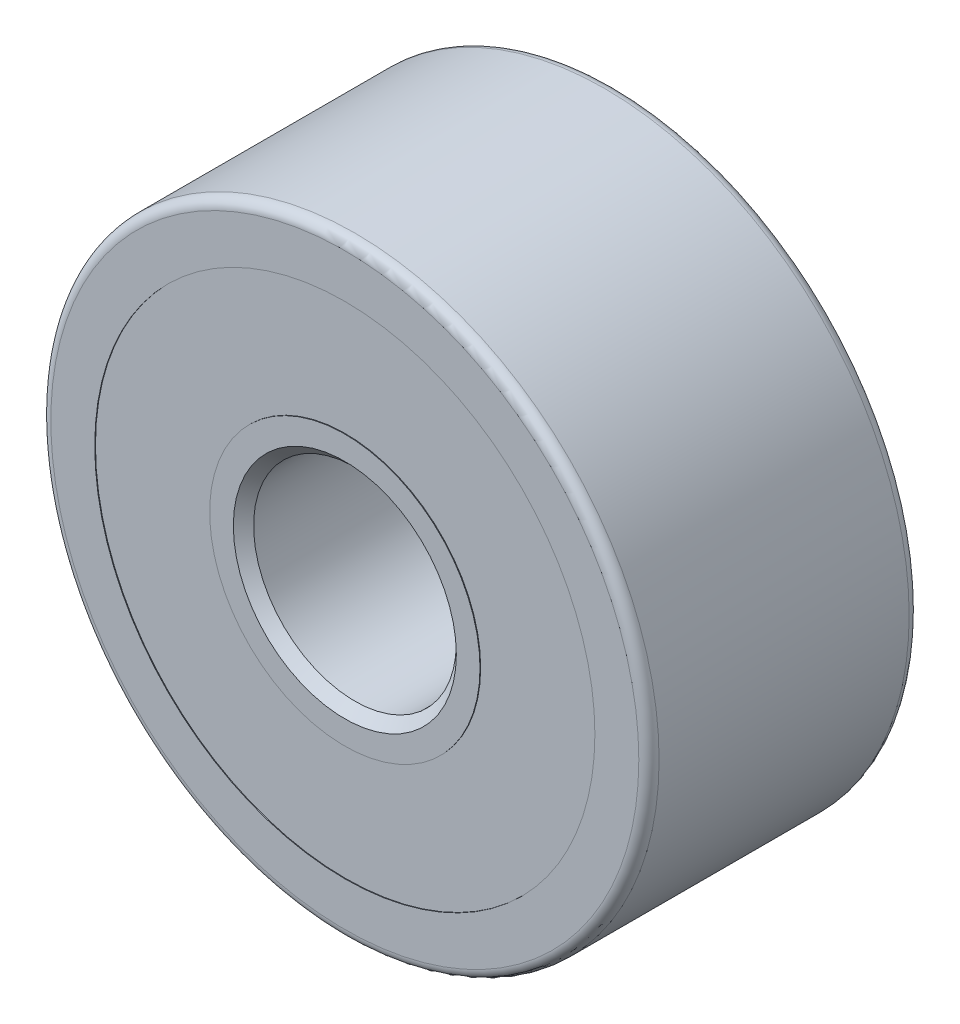
ISO-10303-21;
HEADER;
FILE_DESCRIPTION(('STEP AP214'),'2;1');
FILE_NAME('part.step','',(''),(''),'','','');
FILE_SCHEMA(('AUTOMOTIVE_DESIGN { 1 0 10303 214 1 1 1 1 }'));
ENDSEC;
DATA;
#1=APPLICATION_CONTEXT('core data for automotive mechanical design processes');
#2=APPLICATION_PROTOCOL_DEFINITION('international standard','automotive_design',2000,#1);
#3=PRODUCT_CONTEXT('',#1,'mechanical');
#4=PRODUCT('Part','Part','',(#3));
#5=PRODUCT_RELATED_PRODUCT_CATEGORY('part','',(#4));
#6=PRODUCT_DEFINITION_FORMATION('','',#4);
#7=PRODUCT_DEFINITION_CONTEXT('part definition',#1,'design');
#8=PRODUCT_DEFINITION('design','',#6,#7);
#9=PRODUCT_DEFINITION_SHAPE('','',#8);
#10=(LENGTH_UNIT() NAMED_UNIT(*) SI_UNIT(.MILLI.,.METRE.));
#11=(NAMED_UNIT(*) PLANE_ANGLE_UNIT() SI_UNIT($,.RADIAN.));
#12=(NAMED_UNIT(*) SI_UNIT($,.STERADIAN.) SOLID_ANGLE_UNIT());
#13=UNCERTAINTY_MEASURE_WITH_UNIT(LENGTH_MEASURE(1.E-05),#10,'distance_accuracy_value','');
#14=(GEOMETRIC_REPRESENTATION_CONTEXT(3) GLOBAL_UNCERTAINTY_ASSIGNED_CONTEXT((#13)) GLOBAL_UNIT_ASSIGNED_CONTEXT((#10,
#11,#12)) REPRESENTATION_CONTEXT('',''));
#15=CARTESIAN_POINT('',(0.,0.,0.));
#16=DIRECTION('',(0.,0.,1.));
#17=DIRECTION('',(1.,0.,0.));
#18=AXIS2_PLACEMENT_3D('',#15,#16,#17);
#19=CARTESIAN_POINT('',(0.,0.,-2.));
#20=DIRECTION('',(0.,0.,1.));
#21=DIRECTION('',(1.,0.,0.));
#22=AXIS2_PLACEMENT_3D('',#19,#20,#21);
#23=PLANE('',#22);
#24=CARTESIAN_POINT('',(0.,0.,-2.));
#25=DIRECTION('',(0.,0.,1.));
#26=DIRECTION('',(1.,0.,0.));
#27=AXIS2_PLACEMENT_3D('',#24,#25,#26);
#28=CIRCLE('',#27,1.65);
#29=CARTESIAN_POINT('',(1.65,0.,-2.));
#30=VERTEX_POINT('',#29);
#31=EDGE_CURVE('E28',#30,#30,#28,.T.);
#32=ORIENTED_EDGE('',*,*,#31,.T.);
#33=EDGE_LOOP('',(#32));
#34=FACE_BOUND('',#33,.T.);
#35=CARTESIAN_POINT('',(0.,0.,-2.));
#36=DIRECTION('',(0.,0.,1.));
#37=DIRECTION('',(1.,0.,0.));
#38=AXIS2_PLACEMENT_3D('',#35,#36,#37);
#39=CIRCLE('',#38,2.);
#40=CARTESIAN_POINT('',(2.,0.,-2.));
#41=VERTEX_POINT('',#40);
#42=EDGE_CURVE('E69',#41,#41,#39,.T.);
#43=ORIENTED_EDGE('',*,*,#42,.F.);
#44=EDGE_LOOP('',(#43));
#45=FACE_BOUND('',#44,.T.);
#46=ADVANCED_FACE('F15',(#34,#45),#23,.F.);
#47=CARTESIAN_POINT('',(0.,0.,2.));
#48=DIRECTION('',(0.,0.,1.));
#49=DIRECTION('',(1.,0.,0.));
#50=AXIS2_PLACEMENT_3D('',#47,#48,#49);
#51=PLANE('',#50);
#52=CARTESIAN_POINT('',(0.,0.,2.));
#53=DIRECTION('',(0.,0.,1.));
#54=DIRECTION('',(1.,0.,0.));
#55=AXIS2_PLACEMENT_3D('',#52,#53,#54);
#56=CIRCLE('',#55,1.65);
#57=CARTESIAN_POINT('',(1.65,0.,2.));
#58=VERTEX_POINT('',#57);
#59=EDGE_CURVE('E10',#58,#58,#56,.F.);
#60=ORIENTED_EDGE('',*,*,#59,.T.);
#61=EDGE_LOOP('',(#60));
#62=FACE_BOUND('',#61,.T.);
#63=CARTESIAN_POINT('',(0.,0.,2.));
#64=DIRECTION('',(0.,0.,1.));
#65=DIRECTION('',(1.,0.,0.));
#66=AXIS2_PLACEMENT_3D('',#63,#64,#65);
#67=CIRCLE('',#66,2.);
#68=CARTESIAN_POINT('',(2.,0.,2.));
#69=VERTEX_POINT('',#68);
#70=EDGE_CURVE('E53',#69,#69,#67,.T.);
#71=ORIENTED_EDGE('',*,*,#70,.T.);
#72=EDGE_LOOP('',(#71));
#73=FACE_BOUND('',#72,.T.);
#74=ADVANCED_FACE('F84',(#62,#73),#51,.T.);
#75=CARTESIAN_POINT('',(0.,0.,2.));
#76=DIRECTION('',(0.,0.,1.));
#77=DIRECTION('',(1.,0.,0.));
#78=AXIS2_PLACEMENT_3D('',#75,#76,#77);
#79=CIRCLE('',#78,4.35);
#80=CARTESIAN_POINT('',(4.35,0.,2.));
#81=VERTEX_POINT('',#80);
#82=EDGE_CURVE('E34',#81,#81,#79,.T.);
#83=ORIENTED_EDGE('',*,*,#82,.T.);
#84=EDGE_LOOP('',(#83));
#85=FACE_BOUND('',#84,.T.);
#86=CARTESIAN_POINT('',(0.,0.,2.));
#87=DIRECTION('',(0.,0.,1.));
#88=DIRECTION('',(1.,0.,0.));
#89=AXIS2_PLACEMENT_3D('',#86,#87,#88);
#90=CIRCLE('',#89,3.7);
#91=CARTESIAN_POINT('',(3.7,0.,2.));
#92=VERTEX_POINT('',#91);
#93=EDGE_CURVE('E48',#92,#92,#90,.T.);
#94=ORIENTED_EDGE('',*,*,#93,.F.);
#95=EDGE_LOOP('',(#94));
#96=FACE_BOUND('',#95,.T.);
#97=ADVANCED_FACE('F95',(#85,#96),#51,.T.);
#98=CARTESIAN_POINT('',(0.,0.,-2.));
#99=DIRECTION('',(0.,0.,1.));
#100=DIRECTION('',(1.,0.,0.));
#101=AXIS2_PLACEMENT_3D('',#98,#99,#100);
#102=CIRCLE('',#101,4.35);
#103=CARTESIAN_POINT('',(4.35,0.,-2.));
#104=VERTEX_POINT('',#103);
#105=EDGE_CURVE('E36',#104,#104,#102,.F.);
#106=ORIENTED_EDGE('',*,*,#105,.T.);
#107=EDGE_LOOP('',(#106));
#108=FACE_BOUND('',#107,.T.);
#109=CARTESIAN_POINT('',(0.,0.,-2.));
#110=DIRECTION('',(0.,0.,1.));
#111=DIRECTION('',(1.,0.,0.));
#112=AXIS2_PLACEMENT_3D('',#109,#110,#111);
#113=CIRCLE('',#112,3.7);
#114=CARTESIAN_POINT('',(3.7,0.,-2.));
#115=VERTEX_POINT('',#114);
#116=EDGE_CURVE('E58',#115,#115,#113,.T.);
#117=ORIENTED_EDGE('',*,*,#116,.T.);
#118=EDGE_LOOP('',(#117));
#119=FACE_BOUND('',#118,.T.);
#120=ADVANCED_FACE('F88',(#108,#119),#23,.F.);
#121=CARTESIAN_POINT('',(0.,0.,2.));
#122=DIRECTION('',(0.,0.,-1.));
#123=DIRECTION('',(-1.,0.,0.));
#124=AXIS2_PLACEMENT_3D('',#121,#122,#123);
#125=CYLINDRICAL_SURFACE('',#124,4.5);
#126=CARTESIAN_POINT('',(0.,0.,-1.85));
#127=DIRECTION('',(0.,0.,1.));
#128=DIRECTION('',(1.,0.,0.));
#129=AXIS2_PLACEMENT_3D('',#126,#127,#128);
#130=CIRCLE('',#129,4.5);
#131=CARTESIAN_POINT('',(4.5,0.,-1.85));
#132=VERTEX_POINT('',#131);
#133=EDGE_CURVE('E41',#132,#132,#130,.T.);
#134=ORIENTED_EDGE('',*,*,#133,.T.);
#135=EDGE_LOOP('',(#134));
#136=FACE_BOUND('',#135,.T.);
#137=CARTESIAN_POINT('',(0.,0.,1.85));
#138=DIRECTION('',(0.,0.,1.));
#139=DIRECTION('',(1.,0.,0.));
#140=AXIS2_PLACEMENT_3D('',#137,#138,#139);
#141=CIRCLE('',#140,4.5);
#142=CARTESIAN_POINT('',(4.5,0.,1.85));
#143=VERTEX_POINT('',#142);
#144=EDGE_CURVE('E42',#143,#143,#141,.F.);
#145=ORIENTED_EDGE('',*,*,#144,.T.);
#146=EDGE_LOOP('',(#145));
#147=FACE_BOUND('',#146,.T.);
#148=ADVANCED_FACE('F96',(#136,#147),#125,.T.);
#149=CARTESIAN_POINT('',(0.,0.,2.));
#150=DIRECTION('',(0.,0.,-1.));
#151=DIRECTION('',(-1.,0.,0.));
#152=AXIS2_PLACEMENT_3D('',#149,#150,#151);
#153=CYLINDRICAL_SURFACE('',#152,1.5);
#154=CARTESIAN_POINT('',(0.,0.,-1.85));
#155=DIRECTION('',(0.,0.,1.));
#156=DIRECTION('',(1.,0.,0.));
#157=AXIS2_PLACEMENT_3D('',#154,#155,#156);
#158=CIRCLE('',#157,1.5);
#159=CARTESIAN_POINT('',(1.5,0.,-1.85));
#160=VERTEX_POINT('',#159);
#161=EDGE_CURVE('E22',#160,#160,#158,.F.);
#162=ORIENTED_EDGE('',*,*,#161,.T.);
#163=EDGE_LOOP('',(#162));
#164=FACE_BOUND('',#163,.T.);
#165=CARTESIAN_POINT('',(0.,0.,1.85));
#166=DIRECTION('',(0.,0.,1.));
#167=DIRECTION('',(1.,0.,0.));
#168=AXIS2_PLACEMENT_3D('',#165,#166,#167);
#169=CIRCLE('',#168,1.5);
#170=CARTESIAN_POINT('',(1.5,0.,1.85));
#171=VERTEX_POINT('',#170);
#172=EDGE_CURVE('E27',#171,#171,#169,.T.);
#173=ORIENTED_EDGE('',*,*,#172,.T.);
#174=EDGE_LOOP('',(#173));
#175=FACE_BOUND('',#174,.T.);
#176=ADVANCED_FACE('F103',(#164,#175),#153,.F.);
#177=CARTESIAN_POINT('',(0.,0.,1.99));
#178=DIRECTION('',(0.,0.,1.));
#179=DIRECTION('',(1.,0.,0.));
#180=AXIS2_PLACEMENT_3D('',#177,#178,#179);
#181=CYLINDRICAL_SURFACE('',#180,3.7);
#182=CARTESIAN_POINT('',(0.,0.,1.99));
#183=DIRECTION('',(0.,0.,1.));
#184=DIRECTION('',(1.,0.,0.));
#185=AXIS2_PLACEMENT_3D('',#182,#183,#184);
#186=CIRCLE('',#185,3.7);
#187=CARTESIAN_POINT('',(3.7,0.,1.99));
#188=VERTEX_POINT('',#187);
#189=EDGE_CURVE('E50',#188,#188,#186,.T.);
#190=ORIENTED_EDGE('',*,*,#189,.F.);
#191=EDGE_LOOP('',(#190));
#192=FACE_BOUND('',#191,.T.);
#193=ORIENTED_EDGE('',*,*,#93,.T.);
#194=EDGE_LOOP('',(#193));
#195=FACE_BOUND('',#194,.T.);
#196=ADVANCED_FACE('F128',(#192,#195),#181,.F.);
#197=CARTESIAN_POINT('',(0.,0.,1.99));
#198=DIRECTION('',(0.,0.,1.));
#199=DIRECTION('',(1.,0.,0.));
#200=AXIS2_PLACEMENT_3D('',#197,#198,#199);
#201=PLANE('',#200);
#202=CARTESIAN_POINT('',(0.,0.,1.99));
#203=DIRECTION('',(0.,0.,1.));
#204=DIRECTION('',(1.,0.,0.));
#205=AXIS2_PLACEMENT_3D('',#202,#203,#204);
#206=CIRCLE('',#205,2.);
#207=CARTESIAN_POINT('',(2.,0.,1.99));
#208=VERTEX_POINT('',#207);
#209=EDGE_CURVE('E51',#208,#208,#206,.T.);
#210=ORIENTED_EDGE('',*,*,#209,.F.);
#211=EDGE_LOOP('',(#210));
#212=FACE_BOUND('',#211,.T.);
#213=ORIENTED_EDGE('',*,*,#189,.T.);
#214=EDGE_LOOP('',(#213));
#215=FACE_BOUND('',#214,.T.);
#216=ADVANCED_FACE('F123',(#212,#215),#201,.T.);
#217=CARTESIAN_POINT('',(0.,0.,1.99));
#218=DIRECTION('',(0.,0.,1.));
#219=DIRECTION('',(1.,0.,0.));
#220=AXIS2_PLACEMENT_3D('',#217,#218,#219);
#221=CYLINDRICAL_SURFACE('',#220,2.);
#222=ORIENTED_EDGE('',*,*,#209,.T.);
#223=EDGE_LOOP('',(#222));
#224=FACE_BOUND('',#223,.T.);
#225=ORIENTED_EDGE('',*,*,#70,.F.);
#226=EDGE_LOOP('',(#225));
#227=FACE_BOUND('',#226,.T.);
#228=ADVANCED_FACE('F119',(#224,#227),#221,.T.);
#229=CARTESIAN_POINT('',(0.,0.,-1.99));
#230=DIRECTION('',(0.,0.,-1.));
#231=DIRECTION('',(1.,0.,0.));
#232=AXIS2_PLACEMENT_3D('',#229,#230,#231);
#233=PLANE('',#232);
#234=CARTESIAN_POINT('',(0.,0.,-1.99));
#235=DIRECTION('',(0.,0.,1.));
#236=DIRECTION('',(1.,0.,0.));
#237=AXIS2_PLACEMENT_3D('',#234,#235,#236);
#238=CIRCLE('',#237,3.7);
#239=CARTESIAN_POINT('',(3.7,0.,-1.99));
#240=VERTEX_POINT('',#239);
#241=EDGE_CURVE('E60',#240,#240,#238,.T.);
#242=ORIENTED_EDGE('',*,*,#241,.F.);
#243=EDGE_LOOP('',(#242));
#244=FACE_BOUND('',#243,.T.);
#245=CARTESIAN_POINT('',(0.,0.,-1.99));
#246=DIRECTION('',(0.,0.,1.));
#247=DIRECTION('',(1.,0.,0.));
#248=AXIS2_PLACEMENT_3D('',#245,#246,#247);
#249=CIRCLE('',#248,2.);
#250=CARTESIAN_POINT('',(2.,0.,-1.99));
#251=VERTEX_POINT('',#250);
#252=EDGE_CURVE('E64',#251,#251,#249,.T.);
#253=ORIENTED_EDGE('',*,*,#252,.T.);
#254=EDGE_LOOP('',(#253));
#255=FACE_BOUND('',#254,.T.);
#256=ADVANCED_FACE('F71',(#244,#255),#233,.T.);
#257=CARTESIAN_POINT('',(0.,0.,-1.99));
#258=DIRECTION('',(0.,0.,-1.));
#259=DIRECTION('',(-1.,0.,0.));
#260=AXIS2_PLACEMENT_3D('',#257,#258,#259);
#261=CYLINDRICAL_SURFACE('',#260,3.7);
#262=ORIENTED_EDGE('',*,*,#241,.T.);
#263=EDGE_LOOP('',(#262));
#264=FACE_BOUND('',#263,.T.);
#265=ORIENTED_EDGE('',*,*,#116,.F.);
#266=EDGE_LOOP('',(#265));
#267=FACE_BOUND('',#266,.T.);
#268=ADVANCED_FACE('F77',(#264,#267),#261,.F.);
#269=CARTESIAN_POINT('',(0.,0.,-1.99));
#270=DIRECTION('',(0.,0.,-1.));
#271=DIRECTION('',(-1.,0.,0.));
#272=AXIS2_PLACEMENT_3D('',#269,#270,#271);
#273=CYLINDRICAL_SURFACE('',#272,2.);
#274=ORIENTED_EDGE('',*,*,#252,.F.);
#275=EDGE_LOOP('',(#274));
#276=FACE_BOUND('',#275,.T.);
#277=ORIENTED_EDGE('',*,*,#42,.T.);
#278=EDGE_LOOP('',(#277));
#279=FACE_BOUND('',#278,.T.);
#280=ADVANCED_FACE('F72',(#276,#279),#273,.T.);
#281=CARTESIAN_POINT('',(0.,0.,-1.85));
#282=DIRECTION('',(0.,0.,1.));
#283=DIRECTION('',(1.,0.,0.));
#284=AXIS2_PLACEMENT_3D('',#281,#282,#283);
#285=TOROIDAL_SURFACE('',#284,4.35,0.15);
#286=ORIENTED_EDGE('',*,*,#105,.F.);
#287=EDGE_LOOP('',(#286));
#288=FACE_BOUND('',#287,.T.);
#289=ORIENTED_EDGE('',*,*,#133,.F.);
#290=EDGE_LOOP('',(#289));
#291=FACE_BOUND('',#290,.T.);
#292=ADVANCED_FACE('F80',(#288,#291),#285,.T.);
#293=CARTESIAN_POINT('',(0.,0.,1.85));
#294=DIRECTION('',(0.,0.,1.));
#295=DIRECTION('',(1.,0.,0.));
#296=AXIS2_PLACEMENT_3D('',#293,#294,#295);
#297=TOROIDAL_SURFACE('',#296,4.35,0.15);
#298=ORIENTED_EDGE('',*,*,#144,.F.);
#299=EDGE_LOOP('',(#298));
#300=FACE_BOUND('',#299,.T.);
#301=ORIENTED_EDGE('',*,*,#82,.F.);
#302=EDGE_LOOP('',(#301));
#303=FACE_BOUND('',#302,.T.);
#304=ADVANCED_FACE('F150',(#300,#303),#297,.T.);
#305=CARTESIAN_POINT('',(0.,0.,-2.));
#306=DIRECTION('',(0.,0.,-1.));
#307=DIRECTION('',(-1.,0.,0.));
#308=AXIS2_PLACEMENT_3D('',#305,#306,#307);
#309=CONICAL_SURFACE('',#308,1.65,0.785398163397449);
#310=ORIENTED_EDGE('',*,*,#161,.F.);
#311=EDGE_LOOP('',(#310));
#312=FACE_BOUND('',#311,.T.);
#313=ORIENTED_EDGE('',*,*,#31,.F.);
#314=EDGE_LOOP('',(#313));
#315=FACE_BOUND('',#314,.T.);
#316=ADVANCED_FACE('F143',(#312,#315),#309,.F.);
#317=CARTESIAN_POINT('',(0.,0.,1.85));
#318=DIRECTION('',(0.,0.,1.));
#319=DIRECTION('',(1.,0.,0.));
#320=AXIS2_PLACEMENT_3D('',#317,#318,#319);
#321=CONICAL_SURFACE('',#320,1.5,0.785398163397448);
#322=ORIENTED_EDGE('',*,*,#59,.F.);
#323=EDGE_LOOP('',(#322));
#324=FACE_BOUND('',#323,.T.);
#325=ORIENTED_EDGE('',*,*,#172,.F.);
#326=EDGE_LOOP('',(#325));
#327=FACE_BOUND('',#326,.T.);
#328=ADVANCED_FACE('F17',(#324,#327),#321,.F.);
#329=CLOSED_SHELL('',(#46,#74,#97,#120,#148,#176,#196,#216,#228,#256,#268,#280,#292,#304,#316,#328));
#330=MANIFOLD_SOLID_BREP('B1',#329);
#331=ADVANCED_BREP_SHAPE_REPRESENTATION('',(#18,#330),#14);
#332=SHAPE_DEFINITION_REPRESENTATION(#9,#331);
ENDSEC;
END-ISO-10303-21;
